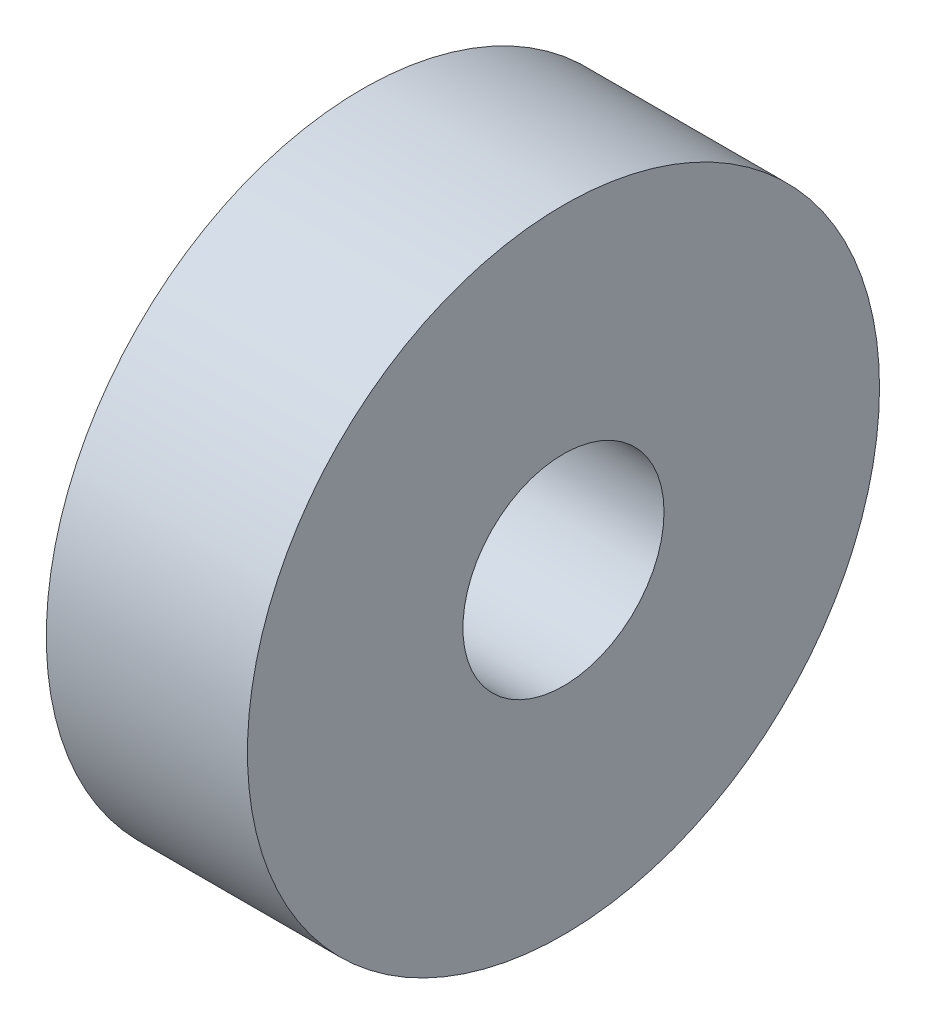
ISO-10303-21;
HEADER;
FILE_DESCRIPTION(('STEP AP214'),'2;1');
FILE_NAME('part.step','',(''),(''),'','','');
FILE_SCHEMA(('AUTOMOTIVE_DESIGN { 1 0 10303 214 1 1 1 1 }'));
ENDSEC;
DATA;
#1=APPLICATION_CONTEXT('core data for automotive mechanical design processes');
#2=APPLICATION_PROTOCOL_DEFINITION('international standard','automotive_design',2000,#1);
#3=PRODUCT_CONTEXT('',#1,'mechanical');
#4=PRODUCT('Part','Part','',(#3));
#5=PRODUCT_RELATED_PRODUCT_CATEGORY('part','',(#4));
#6=PRODUCT_DEFINITION_FORMATION('','',#4);
#7=PRODUCT_DEFINITION_CONTEXT('part definition',#1,'design');
#8=PRODUCT_DEFINITION('design','',#6,#7);
#9=PRODUCT_DEFINITION_SHAPE('','',#8);
#10=(LENGTH_UNIT() NAMED_UNIT(*) SI_UNIT(.MILLI.,.METRE.));
#11=(NAMED_UNIT(*) PLANE_ANGLE_UNIT() SI_UNIT($,.RADIAN.));
#12=(NAMED_UNIT(*) SI_UNIT($,.STERADIAN.) SOLID_ANGLE_UNIT());
#13=UNCERTAINTY_MEASURE_WITH_UNIT(LENGTH_MEASURE(1.E-05),#10,'distance_accuracy_value','');
#14=(GEOMETRIC_REPRESENTATION_CONTEXT(3) GLOBAL_UNCERTAINTY_ASSIGNED_CONTEXT((#13)) GLOBAL_UNIT_ASSIGNED_CONTEXT((#10,
#11,#12)) REPRESENTATION_CONTEXT('',''));
#15=CARTESIAN_POINT('',(0.,0.,0.));
#16=DIRECTION('',(0.,0.,1.));
#17=DIRECTION('',(1.,0.,0.));
#18=AXIS2_PLACEMENT_3D('',#15,#16,#17);
#19=CARTESIAN_POINT('',(-49.6,-80.6,0.));
#20=DIRECTION('',(1.,0.,0.));
#21=DIRECTION('',(0.,0.,-1.));
#22=AXIS2_PLACEMENT_3D('',#19,#20,#21);
#23=CYLINDRICAL_SURFACE('',#22,3.5);
#24=CARTESIAN_POINT('',(-41.6,-80.6,0.));
#25=DIRECTION('',(-1.,0.,0.));
#26=DIRECTION('',(0.,0.,-1.));
#27=AXIS2_PLACEMENT_3D('',#24,#25,#26);
#28=CIRCLE('',#27,3.5);
#29=CARTESIAN_POINT('',(-41.6,-80.6,-3.5));
#30=VERTEX_POINT('',#29);
#31=EDGE_CURVE('E56',#30,#30,#28,.T.);
#32=ORIENTED_EDGE('',*,*,#31,.F.);
#33=DIRECTION('',(1.,0.,0.));
#34=VECTOR('',#33,1.);
#35=CARTESIAN_POINT('',(-49.6,-80.6,-3.5));
#36=LINE('',#35,#34);
#37=CARTESIAN_POINT('',(-48.6,-80.6,-3.5));
#38=VERTEX_POINT('',#37);
#39=EDGE_CURVE('E9',#38,#30,#36,.T.);
#40=ORIENTED_EDGE('',*,*,#39,.F.);
#41=CARTESIAN_POINT('',(-48.6,-80.6,0.));
#42=DIRECTION('',(-1.,0.,0.));
#43=DIRECTION('',(0.,0.,-1.));
#44=AXIS2_PLACEMENT_3D('',#41,#42,#43);
#45=CIRCLE('',#44,3.5);
#46=EDGE_CURVE('E23',#38,#38,#45,.T.);
#47=ORIENTED_EDGE('',*,*,#46,.T.);
#48=ORIENTED_EDGE('',*,*,#39,.T.);
#49=EDGE_LOOP('',(#32,#40,#47,#48));
#50=FACE_BOUND('',#49,.T.);
#51=ADVANCED_FACE('F14',(#50),#23,.F.);
#52=CARTESIAN_POINT('',(-48.6,-80.6,0.));
#53=DIRECTION('',(1.,0.,0.));
#54=DIRECTION('',(0.,0.,1.));
#55=AXIS2_PLACEMENT_3D('',#52,#53,#54);
#56=PLANE('',#55);
#57=ORIENTED_EDGE('',*,*,#46,.F.);
#58=EDGE_LOOP('',(#57));
#59=FACE_BOUND('',#58,.T.);
#60=CARTESIAN_POINT('',(-48.6,-80.6,0.));
#61=DIRECTION('',(-1.,0.,0.));
#62=DIRECTION('',(0.,0.,-1.));
#63=AXIS2_PLACEMENT_3D('',#60,#61,#62);
#64=CIRCLE('',#63,11.);
#65=CARTESIAN_POINT('',(-48.6,-80.6,-11.));
#66=VERTEX_POINT('',#65);
#67=EDGE_CURVE('E42',#66,#66,#64,.T.);
#68=ORIENTED_EDGE('',*,*,#67,.T.);
#69=EDGE_LOOP('',(#68));
#70=FACE_BOUND('',#69,.T.);
#71=ADVANCED_FACE('F79',(#59,#70),#56,.F.);
#72=CARTESIAN_POINT('',(-41.6,-80.6,0.));
#73=DIRECTION('',(1.,0.,0.));
#74=DIRECTION('',(0.,0.,1.));
#75=AXIS2_PLACEMENT_3D('',#72,#73,#74);
#76=PLANE('',#75);
#77=ORIENTED_EDGE('',*,*,#31,.T.);
#78=EDGE_LOOP('',(#77));
#79=FACE_BOUND('',#78,.T.);
#80=CARTESIAN_POINT('',(-41.6,-80.6,0.));
#81=DIRECTION('',(-1.,0.,0.));
#82=DIRECTION('',(0.,0.,-1.));
#83=AXIS2_PLACEMENT_3D('',#80,#81,#82);
#84=CIRCLE('',#83,11.);
#85=CARTESIAN_POINT('',(-41.6,-80.6,-11.));
#86=VERTEX_POINT('',#85);
#87=EDGE_CURVE('E51',#86,#86,#84,.T.);
#88=ORIENTED_EDGE('',*,*,#87,.F.);
#89=EDGE_LOOP('',(#88));
#90=FACE_BOUND('',#89,.T.);
#91=ADVANCED_FACE('F73',(#79,#90),#76,.T.);
#92=CARTESIAN_POINT('',(-48.6,-80.6,0.));
#93=DIRECTION('',(1.,0.,0.));
#94=DIRECTION('',(0.,0.,-1.));
#95=AXIS2_PLACEMENT_3D('',#92,#93,#94);
#96=CYLINDRICAL_SURFACE('',#95,11.);
#97=DIRECTION('',(1.,0.,0.));
#98=VECTOR('',#97,1.);
#99=CARTESIAN_POINT('',(-48.6,-80.6,-11.));
#100=LINE('',#99,#98);
#101=EDGE_CURVE('E53',#66,#86,#100,.T.);
#102=ORIENTED_EDGE('',*,*,#101,.F.);
#103=ORIENTED_EDGE('',*,*,#67,.F.);
#104=ORIENTED_EDGE('',*,*,#101,.T.);
#105=ORIENTED_EDGE('',*,*,#87,.T.);
#106=EDGE_LOOP('',(#102,#103,#104,#105));
#107=FACE_BOUND('',#106,.T.);
#108=ADVANCED_FACE('F52',(#107),#96,.T.);
#109=CLOSED_SHELL('',(#51,#71,#91,#108));
#110=MANIFOLD_SOLID_BREP('B1',#109);
#111=ADVANCED_BREP_SHAPE_REPRESENTATION('',(#18,#110),#14);
#112=SHAPE_DEFINITION_REPRESENTATION(#9,#111);
ENDSEC;
END-ISO-10303-21;
